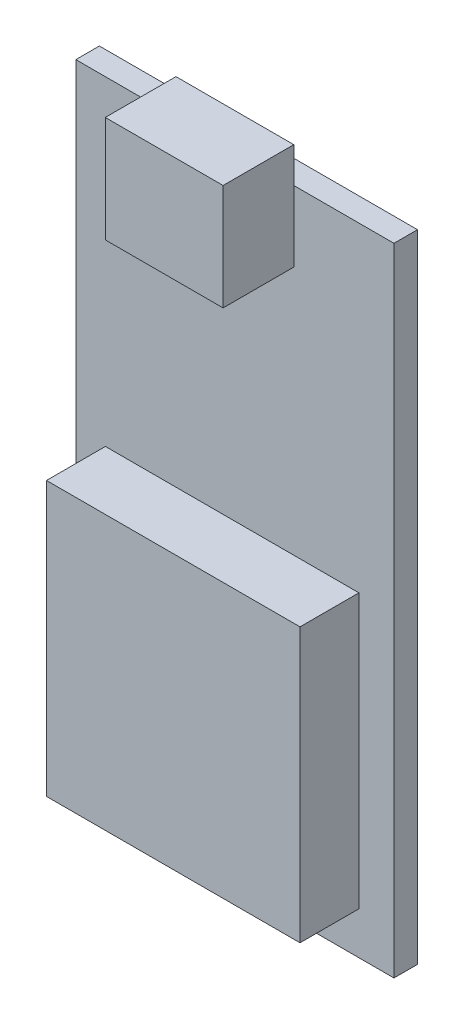
ISO-10303-21;
HEADER;
FILE_DESCRIPTION(('STEP AP214'),'2;1');
FILE_NAME('part.step','',(''),(''),'','','');
FILE_SCHEMA(('AUTOMOTIVE_DESIGN { 1 0 10303 214 1 1 1 1 }'));
ENDSEC;
DATA;
#1=APPLICATION_CONTEXT('core data for automotive mechanical design processes');
#2=APPLICATION_PROTOCOL_DEFINITION('international standard','automotive_design',2000,#1);
#3=PRODUCT_CONTEXT('',#1,'mechanical');
#4=PRODUCT('Part','Part','',(#3));
#5=PRODUCT_RELATED_PRODUCT_CATEGORY('part','',(#4));
#6=PRODUCT_DEFINITION_FORMATION('','',#4);
#7=PRODUCT_DEFINITION_CONTEXT('part definition',#1,'design');
#8=PRODUCT_DEFINITION('design','',#6,#7);
#9=PRODUCT_DEFINITION_SHAPE('','',#8);
#10=(LENGTH_UNIT() NAMED_UNIT(*) SI_UNIT(.MILLI.,.METRE.));
#11=(NAMED_UNIT(*) PLANE_ANGLE_UNIT() SI_UNIT($,.RADIAN.));
#12=(NAMED_UNIT(*) SI_UNIT($,.STERADIAN.) SOLID_ANGLE_UNIT());
#13=UNCERTAINTY_MEASURE_WITH_UNIT(LENGTH_MEASURE(1.E-05),#10,'distance_accuracy_value','');
#14=(GEOMETRIC_REPRESENTATION_CONTEXT(3) GLOBAL_UNCERTAINTY_ASSIGNED_CONTEXT((#13)) GLOBAL_UNIT_ASSIGNED_CONTEXT((#10,
#11,#12)) REPRESENTATION_CONTEXT('',''));
#15=CARTESIAN_POINT('',(0.,0.,0.));
#16=DIRECTION('',(0.,0.,1.));
#17=DIRECTION('',(1.,0.,0.));
#18=AXIS2_PLACEMENT_3D('',#15,#16,#17);
#19=CARTESIAN_POINT('',(0.,0.,2.));
#20=DIRECTION('',(0.,0.,-1.));
#21=DIRECTION('',(-1.,0.,0.));
#22=AXIS2_PLACEMENT_3D('',#19,#20,#21);
#23=PLANE('',#22);
#24=DIRECTION('',(0.,-1.,0.));
#25=VECTOR('',#24,1.);
#26=CARTESIAN_POINT('',(-91.6278397466784,539.638112634693,2.));
#27=LINE('',#26,#25);
#28=CARTESIAN_POINT('',(-91.6278397466784,562.861978671497,2.));
#29=VERTEX_POINT('',#28);
#30=CARTESIAN_POINT('',(-91.6278397466784,539.638112634693,2.));
#31=VERTEX_POINT('',#30);
#32=EDGE_CURVE('E152',#29,#31,#27,.T.);
#33=ORIENTED_EDGE('',*,*,#32,.F.);
#34=DIRECTION('',(-1.,0.,0.));
#35=VECTOR('',#34,1.);
#36=CARTESIAN_POINT('',(-91.6278397466784,562.861978671497,2.));
#37=LINE('',#36,#35);
#38=CARTESIAN_POINT('',(-70.1116109184631,562.861978671497,2.));
#39=VERTEX_POINT('',#38);
#40=EDGE_CURVE('E165',#39,#29,#37,.T.);
#41=ORIENTED_EDGE('',*,*,#40,.F.);
#42=DIRECTION('',(0.,1.,0.));
#43=VECTOR('',#42,1.);
#44=CARTESIAN_POINT('',(-70.1116109184631,539.638112634693,2.));
#45=LINE('',#44,#43);
#46=CARTESIAN_POINT('',(-70.1116109184631,539.638112634693,2.));
#47=VERTEX_POINT('',#46);
#48=EDGE_CURVE('E174',#47,#39,#45,.T.);
#49=ORIENTED_EDGE('',*,*,#48,.F.);
#50=DIRECTION('',(1.,0.,0.));
#51=VECTOR('',#50,1.);
#52=CARTESIAN_POINT('',(-91.6278397466784,539.638112634693,2.));
#53=LINE('',#52,#51);
#54=EDGE_CURVE('E155',#31,#47,#53,.T.);
#55=ORIENTED_EDGE('',*,*,#54,.F.);
#56=EDGE_LOOP('',(#33,#41,#49,#55));
#57=FACE_BOUND('',#56,.T.);
#58=DIRECTION('',(0.,-1.,0.));
#59=VECTOR('',#58,1.);
#60=CARTESIAN_POINT('',(-85.6396133129989,593.037909551865,2.));
#61=LINE('',#60,#59);
#62=CARTESIAN_POINT('',(-85.6396133129989,590.037909551865,2.));
#63=VERTEX_POINT('',#62);
#64=CARTESIAN_POINT('',(-85.6396133129989,584.037909551865,2.));
#65=VERTEX_POINT('',#64);
#66=EDGE_CURVE('E151',#63,#65,#61,.T.);
#67=ORIENTED_EDGE('',*,*,#66,.F.);
#68=DIRECTION('',(-1.,0.,0.));
#69=VECTOR('',#68,1.);
#70=CARTESIAN_POINT('',(-94.1396133129989,590.037909551865,2.));
#71=LINE('',#70,#69);
#72=CARTESIAN_POINT('',(-94.1396133129989,590.037909551865,2.));
#73=VERTEX_POINT('',#72);
#74=EDGE_CURVE('E199',#63,#73,#71,.T.);
#75=ORIENTED_EDGE('',*,*,#74,.T.);
#76=DIRECTION('',(0.,-1.,0.));
#77=VECTOR('',#76,1.);
#78=CARTESIAN_POINT('',(-94.1396133129989,536.037909551865,2.));
#79=LINE('',#78,#77);
#80=CARTESIAN_POINT('',(-94.1396133129989,536.037909551865,2.));
#81=VERTEX_POINT('',#80);
#82=EDGE_CURVE('E191',#73,#81,#79,.T.);
#83=ORIENTED_EDGE('',*,*,#82,.T.);
#84=DIRECTION('',(1.,0.,0.));
#85=VECTOR('',#84,1.);
#86=CARTESIAN_POINT('',(-94.1396133129989,536.037909551865,2.));
#87=LINE('',#86,#85);
#88=CARTESIAN_POINT('',(-67.1396133129989,536.037909551865,2.));
#89=VERTEX_POINT('',#88);
#90=EDGE_CURVE('E194',#81,#89,#87,.T.);
#91=ORIENTED_EDGE('',*,*,#90,.T.);
#92=DIRECTION('',(0.,1.,0.));
#93=VECTOR('',#92,1.);
#94=CARTESIAN_POINT('',(-67.1396133129989,536.037909551865,2.));
#95=LINE('',#94,#93);
#96=CARTESIAN_POINT('',(-67.1396133129989,590.037909551865,2.));
#97=VERTEX_POINT('',#96);
#98=EDGE_CURVE('E197',#89,#97,#95,.T.);
#99=ORIENTED_EDGE('',*,*,#98,.T.);
#100=CARTESIAN_POINT('',(-75.6396133129989,590.037909551865,2.));
#101=VERTEX_POINT('',#100);
#102=EDGE_CURVE('E200',#97,#101,#71,.T.);
#103=ORIENTED_EDGE('',*,*,#102,.T.);
#104=DIRECTION('',(0.,1.,0.));
#105=VECTOR('',#104,1.);
#106=CARTESIAN_POINT('',(-75.6396133129989,593.037909551865,2.));
#107=LINE('',#106,#105);
#108=CARTESIAN_POINT('',(-75.6396133129989,584.037909551865,2.));
#109=VERTEX_POINT('',#108);
#110=EDGE_CURVE('E53',#109,#101,#107,.T.);
#111=ORIENTED_EDGE('',*,*,#110,.F.);
#112=DIRECTION('',(1.,0.,0.));
#113=VECTOR('',#112,1.);
#114=CARTESIAN_POINT('',(-85.6396133129989,584.037909551865,2.));
#115=LINE('',#114,#113);
#116=EDGE_CURVE('E48',#65,#109,#115,.T.);
#117=ORIENTED_EDGE('',*,*,#116,.F.);
#118=EDGE_LOOP('',(#67,#75,#83,#91,#99,#103,#111,#117));
#119=FACE_BOUND('',#118,.T.);
#120=ADVANCED_FACE('F33',(#57,#119),#23,.F.);
#121=CARTESIAN_POINT('',(-94.1396133129989,536.037909551865,2.));
#122=DIRECTION('',(1.,0.,0.));
#123=DIRECTION('',(0.,0.,-1.));
#124=AXIS2_PLACEMENT_3D('',#121,#122,#123);
#125=PLANE('',#124);
#126=DIRECTION('',(0.,-1.,0.));
#127=VECTOR('',#126,1.);
#128=CARTESIAN_POINT('',(-94.1396133129989,536.037909551865,0.));
#129=LINE('',#128,#127);
#130=CARTESIAN_POINT('',(-94.1396133129989,590.037909551865,0.));
#131=VERTEX_POINT('',#130);
#132=CARTESIAN_POINT('',(-94.1396133129989,536.037909551865,0.));
#133=VERTEX_POINT('',#132);
#134=EDGE_CURVE('E190',#131,#133,#129,.T.);
#135=ORIENTED_EDGE('',*,*,#134,.T.);
#136=DIRECTION('',(0.,0.,-1.));
#137=VECTOR('',#136,1.);
#138=CARTESIAN_POINT('',(-94.1396133129989,536.037909551865,2.));
#139=LINE('',#138,#137);
#140=EDGE_CURVE('E11',#81,#133,#139,.T.);
#141=ORIENTED_EDGE('',*,*,#140,.F.);
#142=ORIENTED_EDGE('',*,*,#82,.F.);
#143=DIRECTION('',(0.,0.,-1.));
#144=VECTOR('',#143,1.);
#145=CARTESIAN_POINT('',(-94.1396133129989,590.037909551865,2.));
#146=LINE('',#145,#144);
#147=EDGE_CURVE('E202',#73,#131,#146,.T.);
#148=ORIENTED_EDGE('',*,*,#147,.T.);
#149=EDGE_LOOP('',(#135,#141,#142,#148));
#150=FACE_BOUND('',#149,.T.);
#151=ADVANCED_FACE('F35',(#150),#125,.F.);
#152=CARTESIAN_POINT('',(-94.1396133129989,536.037909551865,2.));
#153=DIRECTION('',(0.,1.,0.));
#154=DIRECTION('',(0.,0.,1.));
#155=AXIS2_PLACEMENT_3D('',#152,#153,#154);
#156=PLANE('',#155);
#157=DIRECTION('',(1.,0.,0.));
#158=VECTOR('',#157,1.);
#159=CARTESIAN_POINT('',(-94.1396133129989,536.037909551865,0.));
#160=LINE('',#159,#158);
#161=CARTESIAN_POINT('',(-67.1396133129989,536.037909551865,0.));
#162=VERTEX_POINT('',#161);
#163=EDGE_CURVE('E206',#133,#162,#160,.T.);
#164=ORIENTED_EDGE('',*,*,#163,.T.);
#165=DIRECTION('',(0.,0.,-1.));
#166=VECTOR('',#165,1.);
#167=CARTESIAN_POINT('',(-67.1396133129989,536.037909551865,2.));
#168=LINE('',#167,#166);
#169=EDGE_CURVE('E41',#89,#162,#168,.T.);
#170=ORIENTED_EDGE('',*,*,#169,.F.);
#171=ORIENTED_EDGE('',*,*,#90,.F.);
#172=ORIENTED_EDGE('',*,*,#140,.T.);
#173=EDGE_LOOP('',(#164,#170,#171,#172));
#174=FACE_BOUND('',#173,.T.);
#175=ADVANCED_FACE('F270',(#174),#156,.F.);
#176=CARTESIAN_POINT('',(-67.1396133129989,536.037909551865,2.));
#177=DIRECTION('',(-1.,0.,0.));
#178=DIRECTION('',(0.,0.,1.));
#179=AXIS2_PLACEMENT_3D('',#176,#177,#178);
#180=PLANE('',#179);
#181=DIRECTION('',(0.,1.,0.));
#182=VECTOR('',#181,1.);
#183=CARTESIAN_POINT('',(-67.1396133129989,536.037909551865,0.));
#184=LINE('',#183,#182);
#185=CARTESIAN_POINT('',(-67.1396133129989,590.037909551865,0.));
#186=VERTEX_POINT('',#185);
#187=EDGE_CURVE('E208',#162,#186,#184,.T.);
#188=ORIENTED_EDGE('',*,*,#187,.T.);
#189=DIRECTION('',(0.,0.,-1.));
#190=VECTOR('',#189,1.);
#191=CARTESIAN_POINT('',(-67.1396133129989,590.037909551865,2.));
#192=LINE('',#191,#190);
#193=EDGE_CURVE('E213',#97,#186,#192,.T.);
#194=ORIENTED_EDGE('',*,*,#193,.F.);
#195=ORIENTED_EDGE('',*,*,#98,.F.);
#196=ORIENTED_EDGE('',*,*,#169,.T.);
#197=EDGE_LOOP('',(#188,#194,#195,#196));
#198=FACE_BOUND('',#197,.T.);
#199=ADVANCED_FACE('F220',(#198),#180,.F.);
#200=CARTESIAN_POINT('',(-94.1396133129989,590.037909551865,2.));
#201=DIRECTION('',(0.,-1.,0.));
#202=DIRECTION('',(0.,0.,-1.));
#203=AXIS2_PLACEMENT_3D('',#200,#201,#202);
#204=PLANE('',#203);
#205=DIRECTION('',(-1.,0.,0.));
#206=VECTOR('',#205,1.);
#207=CARTESIAN_POINT('',(-94.1396133129989,590.037909551865,0.));
#208=LINE('',#207,#206);
#209=EDGE_CURVE('E195',#186,#131,#208,.T.);
#210=ORIENTED_EDGE('',*,*,#209,.T.);
#211=ORIENTED_EDGE('',*,*,#147,.F.);
#212=ORIENTED_EDGE('',*,*,#74,.F.);
#213=EDGE_CURVE('E203',#101,#63,#71,.T.);
#214=ORIENTED_EDGE('',*,*,#213,.F.);
#215=ORIENTED_EDGE('',*,*,#102,.F.);
#216=ORIENTED_EDGE('',*,*,#193,.T.);
#217=EDGE_LOOP('',(#210,#211,#212,#214,#215,#216));
#218=FACE_BOUND('',#217,.T.);
#219=ADVANCED_FACE('F229',(#218),#204,.F.);
#220=CARTESIAN_POINT('',(0.,0.,0.));
#221=DIRECTION('',(0.,0.,-1.));
#222=DIRECTION('',(-1.,0.,0.));
#223=AXIS2_PLACEMENT_3D('',#220,#221,#222);
#224=PLANE('',#223);
#225=ORIENTED_EDGE('',*,*,#134,.F.);
#226=ORIENTED_EDGE('',*,*,#209,.F.);
#227=ORIENTED_EDGE('',*,*,#187,.F.);
#228=ORIENTED_EDGE('',*,*,#163,.F.);
#229=EDGE_LOOP('',(#225,#226,#227,#228));
#230=FACE_BOUND('',#229,.T.);
#231=ADVANCED_FACE('F226',(#230),#224,.T.);
#232=CARTESIAN_POINT('',(-91.6278397466784,539.638112634693,7.));
#233=DIRECTION('',(1.,0.,0.));
#234=DIRECTION('',(0.,0.,-1.));
#235=AXIS2_PLACEMENT_3D('',#232,#233,#234);
#236=PLANE('',#235);
#237=ORIENTED_EDGE('',*,*,#32,.T.);
#238=DIRECTION('',(0.,0.,-1.));
#239=VECTOR('',#238,1.);
#240=CARTESIAN_POINT('',(-91.6278397466784,539.638112634693,7.));
#241=LINE('',#240,#239);
#242=CARTESIAN_POINT('',(-91.6278397466784,539.638112634693,7.));
#243=VERTEX_POINT('',#242);
#244=EDGE_CURVE('E187',#243,#31,#241,.T.);
#245=ORIENTED_EDGE('',*,*,#244,.F.);
#246=DIRECTION('',(0.,-1.,0.));
#247=VECTOR('',#246,1.);
#248=CARTESIAN_POINT('',(-91.6278397466784,539.638112634693,7.));
#249=LINE('',#248,#247);
#250=CARTESIAN_POINT('',(-91.6278397466784,562.861978671497,7.));
#251=VERTEX_POINT('',#250);
#252=EDGE_CURVE('E161',#251,#243,#249,.T.);
#253=ORIENTED_EDGE('',*,*,#252,.F.);
#254=DIRECTION('',(0.,0.,-1.));
#255=VECTOR('',#254,1.);
#256=CARTESIAN_POINT('',(-91.6278397466784,562.861978671497,7.));
#257=LINE('',#256,#255);
#258=EDGE_CURVE('E170',#251,#29,#257,.T.);
#259=ORIENTED_EDGE('',*,*,#258,.T.);
#260=EDGE_LOOP('',(#237,#245,#253,#259));
#261=FACE_BOUND('',#260,.T.);
#262=ADVANCED_FACE('F273',(#261),#236,.F.);
#263=CARTESIAN_POINT('',(-91.6278397466784,539.638112634693,7.));
#264=DIRECTION('',(0.,1.,0.));
#265=DIRECTION('',(0.,0.,1.));
#266=AXIS2_PLACEMENT_3D('',#263,#264,#265);
#267=PLANE('',#266);
#268=ORIENTED_EDGE('',*,*,#54,.T.);
#269=DIRECTION('',(0.,0.,-1.));
#270=VECTOR('',#269,1.);
#271=CARTESIAN_POINT('',(-70.1116109184631,539.638112634693,7.));
#272=LINE('',#271,#270);
#273=CARTESIAN_POINT('',(-70.1116109184631,539.638112634693,7.));
#274=VERTEX_POINT('',#273);
#275=EDGE_CURVE('E184',#274,#47,#272,.T.);
#276=ORIENTED_EDGE('',*,*,#275,.F.);
#277=DIRECTION('',(1.,0.,0.));
#278=VECTOR('',#277,1.);
#279=CARTESIAN_POINT('',(-91.6278397466784,539.638112634693,7.));
#280=LINE('',#279,#278);
#281=EDGE_CURVE('E164',#243,#274,#280,.T.);
#282=ORIENTED_EDGE('',*,*,#281,.F.);
#283=ORIENTED_EDGE('',*,*,#244,.T.);
#284=EDGE_LOOP('',(#268,#276,#282,#283));
#285=FACE_BOUND('',#284,.T.);
#286=ADVANCED_FACE('F304',(#285),#267,.F.);
#287=CARTESIAN_POINT('',(-70.1116109184631,539.638112634693,7.));
#288=DIRECTION('',(-1.,0.,0.));
#289=DIRECTION('',(0.,0.,1.));
#290=AXIS2_PLACEMENT_3D('',#287,#288,#289);
#291=PLANE('',#290);
#292=ORIENTED_EDGE('',*,*,#48,.T.);
#293=DIRECTION('',(0.,0.,-1.));
#294=VECTOR('',#293,1.);
#295=CARTESIAN_POINT('',(-70.1116109184631,562.861978671497,7.));
#296=LINE('',#295,#294);
#297=CARTESIAN_POINT('',(-70.1116109184631,562.861978671497,7.));
#298=VERTEX_POINT('',#297);
#299=EDGE_CURVE('E181',#298,#39,#296,.T.);
#300=ORIENTED_EDGE('',*,*,#299,.F.);
#301=DIRECTION('',(0.,1.,0.));
#302=VECTOR('',#301,1.);
#303=CARTESIAN_POINT('',(-70.1116109184631,539.638112634693,7.));
#304=LINE('',#303,#302);
#305=EDGE_CURVE('E167',#274,#298,#304,.T.);
#306=ORIENTED_EDGE('',*,*,#305,.F.);
#307=ORIENTED_EDGE('',*,*,#275,.T.);
#308=EDGE_LOOP('',(#292,#300,#306,#307));
#309=FACE_BOUND('',#308,.T.);
#310=ADVANCED_FACE('F311',(#309),#291,.F.);
#311=CARTESIAN_POINT('',(-91.6278397466784,562.861978671497,7.));
#312=DIRECTION('',(0.,-1.,0.));
#313=DIRECTION('',(0.,0.,-1.));
#314=AXIS2_PLACEMENT_3D('',#311,#312,#313);
#315=PLANE('',#314);
#316=ORIENTED_EDGE('',*,*,#40,.T.);
#317=ORIENTED_EDGE('',*,*,#258,.F.);
#318=DIRECTION('',(-1.,0.,0.));
#319=VECTOR('',#318,1.);
#320=CARTESIAN_POINT('',(-91.6278397466784,562.861978671497,7.));
#321=LINE('',#320,#319);
#322=EDGE_CURVE('E169',#298,#251,#321,.T.);
#323=ORIENTED_EDGE('',*,*,#322,.F.);
#324=ORIENTED_EDGE('',*,*,#299,.T.);
#325=EDGE_LOOP('',(#316,#317,#323,#324));
#326=FACE_BOUND('',#325,.T.);
#327=ADVANCED_FACE('F318',(#326),#315,.F.);
#328=CARTESIAN_POINT('',(0.,0.,7.));
#329=DIRECTION('',(0.,0.,-1.));
#330=DIRECTION('',(-1.,0.,0.));
#331=AXIS2_PLACEMENT_3D('',#328,#329,#330);
#332=PLANE('',#331);
#333=ORIENTED_EDGE('',*,*,#252,.T.);
#334=ORIENTED_EDGE('',*,*,#281,.T.);
#335=ORIENTED_EDGE('',*,*,#305,.T.);
#336=ORIENTED_EDGE('',*,*,#322,.T.);
#337=EDGE_LOOP('',(#333,#334,#335,#336));
#338=FACE_BOUND('',#337,.T.);
#339=ADVANCED_FACE('F326',(#338),#332,.F.);
#340=CARTESIAN_POINT('',(0.,0.,2.));
#341=DIRECTION('',(0.,0.,1.));
#342=DIRECTION('',(1.,0.,0.));
#343=AXIS2_PLACEMENT_3D('',#340,#341,#342);
#344=PLANE('',#343);
#345=CARTESIAN_POINT('',(-75.6396133129989,593.037909551865,2.));
#346=VERTEX_POINT('',#345);
#347=EDGE_CURVE('E241',#101,#346,#107,.T.);
#348=ORIENTED_EDGE('',*,*,#347,.F.);
#349=ORIENTED_EDGE('',*,*,#213,.T.);
#350=CARTESIAN_POINT('',(-85.6396133129989,593.037909551865,2.));
#351=VERTEX_POINT('',#350);
#352=EDGE_CURVE('E240',#351,#63,#61,.T.);
#353=ORIENTED_EDGE('',*,*,#352,.F.);
#354=DIRECTION('',(-1.,0.,0.));
#355=VECTOR('',#354,1.);
#356=CARTESIAN_POINT('',(-85.6396133129989,593.037909551865,2.));
#357=LINE('',#356,#355);
#358=EDGE_CURVE('E147',#346,#351,#357,.T.);
#359=ORIENTED_EDGE('',*,*,#358,.F.);
#360=EDGE_LOOP('',(#348,#349,#353,#359));
#361=FACE_BOUND('',#360,.T.);
#362=ADVANCED_FACE('F238',(#361),#344,.F.);
#363=CARTESIAN_POINT('',(-85.6396133129989,593.037909551865,8.));
#364=DIRECTION('',(1.,0.,0.));
#365=DIRECTION('',(0.,0.,-1.));
#366=AXIS2_PLACEMENT_3D('',#363,#364,#365);
#367=PLANE('',#366);
#368=ORIENTED_EDGE('',*,*,#352,.T.);
#369=ORIENTED_EDGE('',*,*,#66,.T.);
#370=DIRECTION('',(0.,0.,-1.));
#371=VECTOR('',#370,1.);
#372=CARTESIAN_POINT('',(-85.6396133129989,584.037909551865,8.));
#373=LINE('',#372,#371);
#374=CARTESIAN_POINT('',(-85.6396133129989,584.037909551865,8.));
#375=VERTEX_POINT('',#374);
#376=EDGE_CURVE('E132',#375,#65,#373,.T.);
#377=ORIENTED_EDGE('',*,*,#376,.F.);
#378=DIRECTION('',(0.,-1.,0.));
#379=VECTOR('',#378,1.);
#380=CARTESIAN_POINT('',(-85.6396133129989,593.037909551865,8.));
#381=LINE('',#380,#379);
#382=CARTESIAN_POINT('',(-85.6396133129989,593.037909551865,8.));
#383=VERTEX_POINT('',#382);
#384=EDGE_CURVE('E138',#383,#375,#381,.T.);
#385=ORIENTED_EDGE('',*,*,#384,.F.);
#386=DIRECTION('',(0.,0.,-1.));
#387=VECTOR('',#386,1.);
#388=CARTESIAN_POINT('',(-85.6396133129989,593.037909551865,8.));
#389=LINE('',#388,#387);
#390=EDGE_CURVE('E242',#383,#351,#389,.T.);
#391=ORIENTED_EDGE('',*,*,#390,.T.);
#392=EDGE_LOOP('',(#368,#369,#377,#385,#391));
#393=FACE_BOUND('',#392,.T.);
#394=ADVANCED_FACE('F150',(#393),#367,.F.);
#395=CARTESIAN_POINT('',(-85.6396133129989,584.037909551865,8.));
#396=DIRECTION('',(0.,1.,0.));
#397=DIRECTION('',(0.,0.,1.));
#398=AXIS2_PLACEMENT_3D('',#395,#396,#397);
#399=PLANE('',#398);
#400=ORIENTED_EDGE('',*,*,#116,.T.);
#401=DIRECTION('',(0.,0.,-1.));
#402=VECTOR('',#401,1.);
#403=CARTESIAN_POINT('',(-75.6396133129989,584.037909551865,8.));
#404=LINE('',#403,#402);
#405=CARTESIAN_POINT('',(-75.6396133129989,584.037909551865,8.));
#406=VERTEX_POINT('',#405);
#407=EDGE_CURVE('E134',#406,#109,#404,.T.);
#408=ORIENTED_EDGE('',*,*,#407,.F.);
#409=DIRECTION('',(1.,0.,0.));
#410=VECTOR('',#409,1.);
#411=CARTESIAN_POINT('',(-85.6396133129989,584.037909551865,8.));
#412=LINE('',#411,#410);
#413=EDGE_CURVE('E128',#375,#406,#412,.T.);
#414=ORIENTED_EDGE('',*,*,#413,.F.);
#415=ORIENTED_EDGE('',*,*,#376,.T.);
#416=EDGE_LOOP('',(#400,#408,#414,#415));
#417=FACE_BOUND('',#416,.T.);
#418=ADVANCED_FACE('F130',(#417),#399,.F.);
#419=CARTESIAN_POINT('',(-75.6396133129989,593.037909551865,8.));
#420=DIRECTION('',(-1.,0.,0.));
#421=DIRECTION('',(0.,0.,1.));
#422=AXIS2_PLACEMENT_3D('',#419,#420,#421);
#423=PLANE('',#422);
#424=ORIENTED_EDGE('',*,*,#110,.T.);
#425=ORIENTED_EDGE('',*,*,#347,.T.);
#426=DIRECTION('',(0.,0.,-1.));
#427=VECTOR('',#426,1.);
#428=CARTESIAN_POINT('',(-75.6396133129989,593.037909551865,8.));
#429=LINE('',#428,#427);
#430=CARTESIAN_POINT('',(-75.6396133129989,593.037909551865,8.));
#431=VERTEX_POINT('',#430);
#432=EDGE_CURVE('E157',#431,#346,#429,.T.);
#433=ORIENTED_EDGE('',*,*,#432,.F.);
#434=DIRECTION('',(0.,1.,0.));
#435=VECTOR('',#434,1.);
#436=CARTESIAN_POINT('',(-75.6396133129989,593.037909551865,8.));
#437=LINE('',#436,#435);
#438=EDGE_CURVE('E137',#406,#431,#437,.T.);
#439=ORIENTED_EDGE('',*,*,#438,.F.);
#440=ORIENTED_EDGE('',*,*,#407,.T.);
#441=EDGE_LOOP('',(#424,#425,#433,#439,#440));
#442=FACE_BOUND('',#441,.T.);
#443=ADVANCED_FACE('F255',(#442),#423,.F.);
#444=CARTESIAN_POINT('',(-85.6396133129989,593.037909551865,8.));
#445=DIRECTION('',(0.,-1.,0.));
#446=DIRECTION('',(0.,0.,-1.));
#447=AXIS2_PLACEMENT_3D('',#444,#445,#446);
#448=PLANE('',#447);
#449=ORIENTED_EDGE('',*,*,#358,.T.);
#450=ORIENTED_EDGE('',*,*,#390,.F.);
#451=DIRECTION('',(-1.,0.,0.));
#452=VECTOR('',#451,1.);
#453=CARTESIAN_POINT('',(-85.6396133129989,593.037909551865,8.));
#454=LINE('',#453,#452);
#455=EDGE_CURVE('E143',#431,#383,#454,.T.);
#456=ORIENTED_EDGE('',*,*,#455,.F.);
#457=ORIENTED_EDGE('',*,*,#432,.T.);
#458=EDGE_LOOP('',(#449,#450,#456,#457));
#459=FACE_BOUND('',#458,.T.);
#460=ADVANCED_FACE('F253',(#459),#448,.F.);
#461=CARTESIAN_POINT('',(0.,0.,8.));
#462=DIRECTION('',(0.,0.,1.));
#463=DIRECTION('',(1.,0.,0.));
#464=AXIS2_PLACEMENT_3D('',#461,#462,#463);
#465=PLANE('',#464);
#466=ORIENTED_EDGE('',*,*,#384,.T.);
#467=ORIENTED_EDGE('',*,*,#413,.T.);
#468=ORIENTED_EDGE('',*,*,#438,.T.);
#469=ORIENTED_EDGE('',*,*,#455,.T.);
#470=EDGE_LOOP('',(#466,#467,#468,#469));
#471=FACE_BOUND('',#470,.T.);
#472=ADVANCED_FACE('F141',(#471),#465,.T.);
#473=CLOSED_SHELL('',(#120,#151,#175,#199,#219,#231,#262,#286,#310,#327,#339,#362,#394,#418,
#443,#460,#472));
#474=MANIFOLD_SOLID_BREP('B2',#473);
#475=ADVANCED_BREP_SHAPE_REPRESENTATION('',(#18,#474),#14);
#476=SHAPE_DEFINITION_REPRESENTATION(#9,#475);
ENDSEC;
END-ISO-10303-21;
